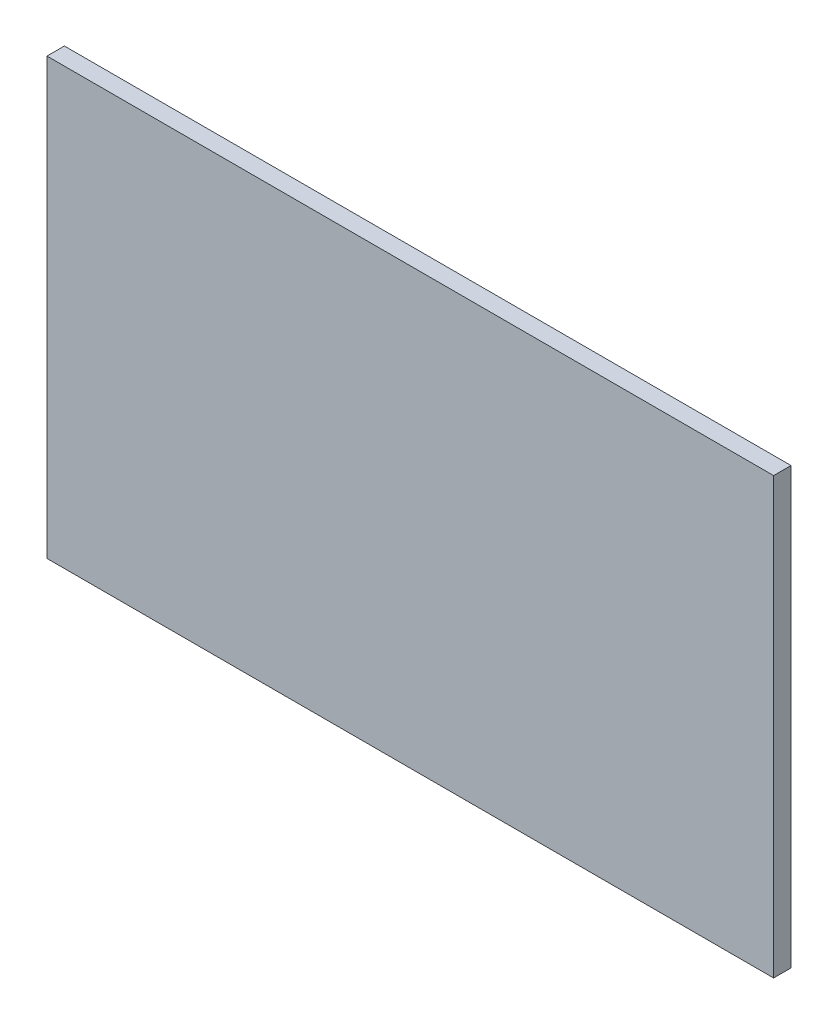
ISO-10303-21;
HEADER;
FILE_DESCRIPTION(('STEP AP214'),'2;1');
FILE_NAME('part.step','',(''),(''),'','','');
FILE_SCHEMA(('AUTOMOTIVE_DESIGN { 1 0 10303 214 1 1 1 1 }'));
ENDSEC;
DATA;
#1=APPLICATION_CONTEXT('core data for automotive mechanical design processes');
#2=APPLICATION_PROTOCOL_DEFINITION('international standard','automotive_design',2000,#1);
#3=PRODUCT_CONTEXT('',#1,'mechanical');
#4=PRODUCT('Part','Part','',(#3));
#5=PRODUCT_RELATED_PRODUCT_CATEGORY('part','',(#4));
#6=PRODUCT_DEFINITION_FORMATION('','',#4);
#7=PRODUCT_DEFINITION_CONTEXT('part definition',#1,'design');
#8=PRODUCT_DEFINITION('design','',#6,#7);
#9=PRODUCT_DEFINITION_SHAPE('','',#8);
#10=(LENGTH_UNIT() NAMED_UNIT(*) SI_UNIT(.MILLI.,.METRE.));
#11=(NAMED_UNIT(*) PLANE_ANGLE_UNIT() SI_UNIT($,.RADIAN.));
#12=(NAMED_UNIT(*) SI_UNIT($,.STERADIAN.) SOLID_ANGLE_UNIT());
#13=UNCERTAINTY_MEASURE_WITH_UNIT(LENGTH_MEASURE(1.E-05),#10,'distance_accuracy_value','');
#14=(GEOMETRIC_REPRESENTATION_CONTEXT(3) GLOBAL_UNCERTAINTY_ASSIGNED_CONTEXT((#13)) GLOBAL_UNIT_ASSIGNED_CONTEXT((#10,
#11,#12)) REPRESENTATION_CONTEXT('',''));
#15=CARTESIAN_POINT('',(0.,0.,0.));
#16=DIRECTION('',(0.,0.,1.));
#17=DIRECTION('',(1.,0.,0.));
#18=AXIS2_PLACEMENT_3D('',#15,#16,#17);
#19=CARTESIAN_POINT('',(-417.5,-250.,20.));
#20=DIRECTION('',(1.,0.,0.));
#21=DIRECTION('',(0.,0.,-1.));
#22=AXIS2_PLACEMENT_3D('',#19,#20,#21);
#23=PLANE('',#22);
#24=DIRECTION('',(0.,-1.,0.));
#25=VECTOR('',#24,1.);
#26=CARTESIAN_POINT('',(-417.5,-250.,0.));
#27=LINE('',#26,#25);
#28=CARTESIAN_POINT('',(-417.5,250.,0.));
#29=VERTEX_POINT('',#28);
#30=CARTESIAN_POINT('',(-417.5,-250.,0.));
#31=VERTEX_POINT('',#30);
#32=EDGE_CURVE('E100',#29,#31,#27,.T.);
#33=ORIENTED_EDGE('',*,*,#32,.T.);
#34=DIRECTION('',(0.,0.,-1.));
#35=VECTOR('',#34,1.);
#36=CARTESIAN_POINT('',(-417.5,-250.,20.));
#37=LINE('',#36,#35);
#38=CARTESIAN_POINT('',(-417.5,-250.,20.));
#39=VERTEX_POINT('',#38);
#40=EDGE_CURVE('E11',#39,#31,#37,.T.);
#41=ORIENTED_EDGE('',*,*,#40,.F.);
#42=DIRECTION('',(0.,-1.,0.));
#43=VECTOR('',#42,1.);
#44=CARTESIAN_POINT('',(-417.5,-250.,20.));
#45=LINE('',#44,#43);
#46=CARTESIAN_POINT('',(-417.5,250.,20.));
#47=VERTEX_POINT('',#46);
#48=EDGE_CURVE('E88',#47,#39,#45,.T.);
#49=ORIENTED_EDGE('',*,*,#48,.F.);
#50=DIRECTION('',(0.,0.,-1.));
#51=VECTOR('',#50,1.);
#52=CARTESIAN_POINT('',(-417.5,250.,20.));
#53=LINE('',#52,#51);
#54=EDGE_CURVE('E96',#47,#29,#53,.T.);
#55=ORIENTED_EDGE('',*,*,#54,.T.);
#56=EDGE_LOOP('',(#33,#41,#49,#55));
#57=FACE_BOUND('',#56,.T.);
#58=ADVANCED_FACE('F37',(#57),#23,.F.);
#59=CARTESIAN_POINT('',(417.5,-250.,20.));
#60=DIRECTION('',(0.,1.,0.));
#61=DIRECTION('',(-1.,0.,0.));
#62=AXIS2_PLACEMENT_3D('',#59,#60,#61);
#63=PLANE('',#62);
#64=DIRECTION('',(1.,0.,0.));
#65=VECTOR('',#64,1.);
#66=CARTESIAN_POINT('',(417.5,-250.,0.));
#67=LINE('',#66,#65);
#68=CARTESIAN_POINT('',(417.5,-250.,0.));
#69=VERTEX_POINT('',#68);
#70=EDGE_CURVE('E92',#31,#69,#67,.T.);
#71=ORIENTED_EDGE('',*,*,#70,.T.);
#72=DIRECTION('',(0.,0.,-1.));
#73=VECTOR('',#72,1.);
#74=CARTESIAN_POINT('',(417.5,-250.,20.));
#75=LINE('',#74,#73);
#76=CARTESIAN_POINT('',(417.5,-250.,20.));
#77=VERTEX_POINT('',#76);
#78=EDGE_CURVE('E45',#77,#69,#75,.T.);
#79=ORIENTED_EDGE('',*,*,#78,.F.);
#80=DIRECTION('',(1.,0.,0.));
#81=VECTOR('',#80,1.);
#82=CARTESIAN_POINT('',(417.5,-250.,20.));
#83=LINE('',#82,#81);
#84=EDGE_CURVE('E83',#39,#77,#83,.T.);
#85=ORIENTED_EDGE('',*,*,#84,.F.);
#86=ORIENTED_EDGE('',*,*,#40,.T.);
#87=EDGE_LOOP('',(#71,#79,#85,#86));
#88=FACE_BOUND('',#87,.T.);
#89=ADVANCED_FACE('F91',(#88),#63,.F.);
#90=CARTESIAN_POINT('',(417.5,-250.,20.));
#91=DIRECTION('',(-1.,0.,0.));
#92=DIRECTION('',(0.,0.,1.));
#93=AXIS2_PLACEMENT_3D('',#90,#91,#92);
#94=PLANE('',#93);
#95=DIRECTION('',(0.,1.,0.));
#96=VECTOR('',#95,1.);
#97=CARTESIAN_POINT('',(417.5,-250.,0.));
#98=LINE('',#97,#96);
#99=CARTESIAN_POINT('',(417.5,250.,0.));
#100=VERTEX_POINT('',#99);
#101=EDGE_CURVE('E70',#69,#100,#98,.T.);
#102=ORIENTED_EDGE('',*,*,#101,.T.);
#103=DIRECTION('',(0.,0.,-1.));
#104=VECTOR('',#103,1.);
#105=CARTESIAN_POINT('',(417.5,250.,20.));
#106=LINE('',#105,#104);
#107=CARTESIAN_POINT('',(417.5,250.,20.));
#108=VERTEX_POINT('',#107);
#109=EDGE_CURVE('E93',#108,#100,#106,.T.);
#110=ORIENTED_EDGE('',*,*,#109,.F.);
#111=DIRECTION('',(0.,1.,0.));
#112=VECTOR('',#111,1.);
#113=CARTESIAN_POINT('',(417.5,-250.,20.));
#114=LINE('',#113,#112);
#115=EDGE_CURVE('E86',#77,#108,#114,.T.);
#116=ORIENTED_EDGE('',*,*,#115,.F.);
#117=ORIENTED_EDGE('',*,*,#78,.T.);
#118=EDGE_LOOP('',(#102,#110,#116,#117));
#119=FACE_BOUND('',#118,.T.);
#120=ADVANCED_FACE('F94',(#119),#94,.F.);
#121=CARTESIAN_POINT('',(417.5,250.,20.));
#122=DIRECTION('',(0.,-1.,0.));
#123=DIRECTION('',(1.,0.,0.));
#124=AXIS2_PLACEMENT_3D('',#121,#122,#123);
#125=PLANE('',#124);
#126=DIRECTION('',(-1.,0.,0.));
#127=VECTOR('',#126,1.);
#128=CARTESIAN_POINT('',(417.5,250.,0.));
#129=LINE('',#128,#127);
#130=EDGE_CURVE('E76',#100,#29,#129,.T.);
#131=ORIENTED_EDGE('',*,*,#130,.T.);
#132=ORIENTED_EDGE('',*,*,#54,.F.);
#133=DIRECTION('',(-1.,0.,0.));
#134=VECTOR('',#133,1.);
#135=CARTESIAN_POINT('',(417.5,250.,20.));
#136=LINE('',#135,#134);
#137=EDGE_CURVE('E53',#108,#47,#136,.T.);
#138=ORIENTED_EDGE('',*,*,#137,.F.);
#139=ORIENTED_EDGE('',*,*,#109,.T.);
#140=EDGE_LOOP('',(#131,#132,#138,#139));
#141=FACE_BOUND('',#140,.T.);
#142=ADVANCED_FACE('F107',(#141),#125,.F.);
#143=CARTESIAN_POINT('',(0.,0.,20.));
#144=DIRECTION('',(0.,0.,1.));
#145=DIRECTION('',(1.,0.,0.));
#146=AXIS2_PLACEMENT_3D('',#143,#144,#145);
#147=PLANE('',#146);
#148=ORIENTED_EDGE('',*,*,#48,.T.);
#149=ORIENTED_EDGE('',*,*,#84,.T.);
#150=ORIENTED_EDGE('',*,*,#115,.T.);
#151=ORIENTED_EDGE('',*,*,#137,.T.);
#152=EDGE_LOOP('',(#148,#149,#150,#151));
#153=FACE_BOUND('',#152,.T.);
#154=ADVANCED_FACE('F84',(#153),#147,.T.);
#155=CARTESIAN_POINT('',(0.,0.,0.));
#156=DIRECTION('',(0.,0.,1.));
#157=DIRECTION('',(1.,0.,0.));
#158=AXIS2_PLACEMENT_3D('',#155,#156,#157);
#159=PLANE('',#158);
#160=ORIENTED_EDGE('',*,*,#32,.F.);
#161=ORIENTED_EDGE('',*,*,#130,.F.);
#162=ORIENTED_EDGE('',*,*,#101,.F.);
#163=ORIENTED_EDGE('',*,*,#70,.F.);
#164=EDGE_LOOP('',(#160,#161,#162,#163));
#165=FACE_BOUND('',#164,.T.);
#166=ADVANCED_FACE('F110',(#165),#159,.F.);
#167=CLOSED_SHELL('',(#58,#89,#120,#142,#154,#166));
#168=MANIFOLD_SOLID_BREP('B2',#167);
#169=ADVANCED_BREP_SHAPE_REPRESENTATION('',(#18,#168),#14);
#170=SHAPE_DEFINITION_REPRESENTATION(#9,#169);
ENDSEC;
END-ISO-10303-21;
